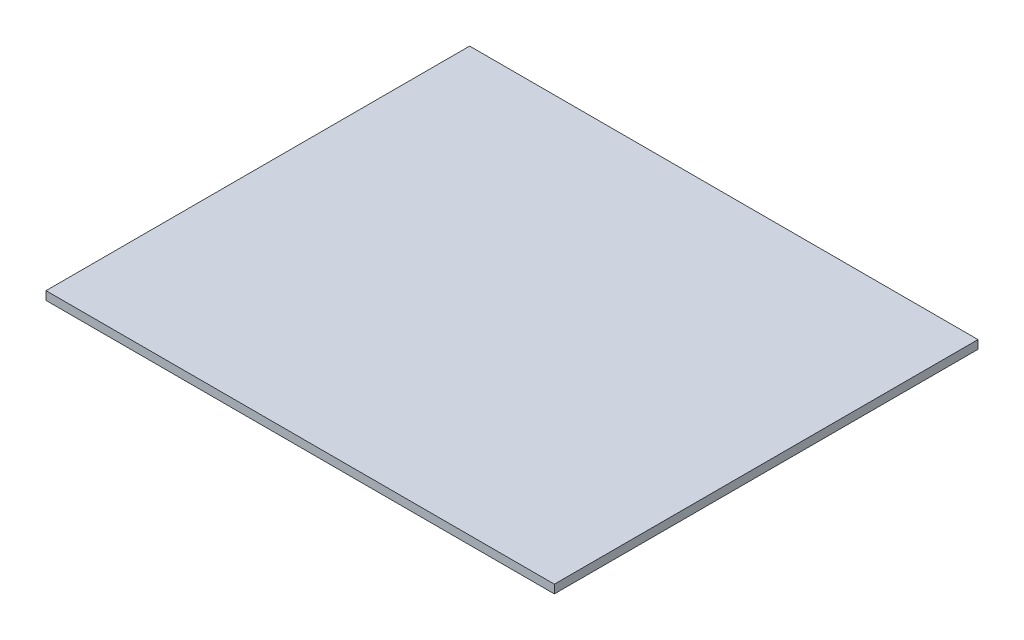
ISO-10303-21;
HEADER;
FILE_DESCRIPTION(('STEP AP214'),'2;1');
FILE_NAME('part.step','',(''),(''),'','','');
FILE_SCHEMA(('AUTOMOTIVE_DESIGN { 1 0 10303 214 1 1 1 1 }'));
ENDSEC;
DATA;
#1=APPLICATION_CONTEXT('core data for automotive mechanical design processes');
#2=APPLICATION_PROTOCOL_DEFINITION('international standard','automotive_design',2000,#1);
#3=PRODUCT_CONTEXT('',#1,'mechanical');
#4=PRODUCT('Part','Part','',(#3));
#5=PRODUCT_RELATED_PRODUCT_CATEGORY('part','',(#4));
#6=PRODUCT_DEFINITION_FORMATION('','',#4);
#7=PRODUCT_DEFINITION_CONTEXT('part definition',#1,'design');
#8=PRODUCT_DEFINITION('design','',#6,#7);
#9=PRODUCT_DEFINITION_SHAPE('','',#8);
#10=(LENGTH_UNIT() NAMED_UNIT(*) SI_UNIT(.MILLI.,.METRE.));
#11=(NAMED_UNIT(*) PLANE_ANGLE_UNIT() SI_UNIT($,.RADIAN.));
#12=(NAMED_UNIT(*) SI_UNIT($,.STERADIAN.) SOLID_ANGLE_UNIT());
#13=UNCERTAINTY_MEASURE_WITH_UNIT(LENGTH_MEASURE(1.E-05),#10,'distance_accuracy_value','');
#14=(GEOMETRIC_REPRESENTATION_CONTEXT(3) GLOBAL_UNCERTAINTY_ASSIGNED_CONTEXT((#13)) GLOBAL_UNIT_ASSIGNED_CONTEXT((#10,
#11,#12)) REPRESENTATION_CONTEXT('',''));
#15=CARTESIAN_POINT('',(0.,0.,0.));
#16=DIRECTION('',(0.,0.,1.));
#17=DIRECTION('',(1.,0.,0.));
#18=AXIS2_PLACEMENT_3D('',#15,#16,#17);
#19=CARTESIAN_POINT('',(90.,3.,75.));
#20=DIRECTION('',(-1.,0.,0.));
#21=DIRECTION('',(0.,0.,1.));
#22=AXIS2_PLACEMENT_3D('',#19,#20,#21);
#23=PLANE('',#22);
#24=DIRECTION('',(0.,0.,-1.));
#25=VECTOR('',#24,1.);
#26=CARTESIAN_POINT('',(90.,0.,75.));
#27=LINE('',#26,#25);
#28=CARTESIAN_POINT('',(90.,0.,75.));
#29=VERTEX_POINT('',#28);
#30=CARTESIAN_POINT('',(90.,0.,-75.));
#31=VERTEX_POINT('',#30);
#32=EDGE_CURVE('E98',#29,#31,#27,.T.);
#33=ORIENTED_EDGE('',*,*,#32,.T.);
#34=DIRECTION('',(0.,-1.,0.));
#35=VECTOR('',#34,1.);
#36=CARTESIAN_POINT('',(90.,3.,-75.));
#37=LINE('',#36,#35);
#38=CARTESIAN_POINT('',(90.,3.,-75.));
#39=VERTEX_POINT('',#38);
#40=EDGE_CURVE('E11',#39,#31,#37,.T.);
#41=ORIENTED_EDGE('',*,*,#40,.F.);
#42=DIRECTION('',(0.,0.,-1.));
#43=VECTOR('',#42,1.);
#44=CARTESIAN_POINT('',(90.,3.,75.));
#45=LINE('',#44,#43);
#46=CARTESIAN_POINT('',(90.,3.,75.));
#47=VERTEX_POINT('',#46);
#48=EDGE_CURVE('E86',#47,#39,#45,.T.);
#49=ORIENTED_EDGE('',*,*,#48,.F.);
#50=DIRECTION('',(0.,-1.,0.));
#51=VECTOR('',#50,1.);
#52=CARTESIAN_POINT('',(90.,3.,75.));
#53=LINE('',#52,#51);
#54=EDGE_CURVE('E94',#47,#29,#53,.T.);
#55=ORIENTED_EDGE('',*,*,#54,.T.);
#56=EDGE_LOOP('',(#33,#41,#49,#55));
#57=FACE_BOUND('',#56,.T.);
#58=ADVANCED_FACE('F35',(#57),#23,.F.);
#59=CARTESIAN_POINT('',(-90.,3.,-75.));
#60=DIRECTION('',(0.,0.,1.));
#61=DIRECTION('',(1.,0.,0.));
#62=AXIS2_PLACEMENT_3D('',#59,#60,#61);
#63=PLANE('',#62);
#64=DIRECTION('',(-1.,0.,0.));
#65=VECTOR('',#64,1.);
#66=CARTESIAN_POINT('',(-90.,0.,-75.));
#67=LINE('',#66,#65);
#68=CARTESIAN_POINT('',(-90.,0.,-75.));
#69=VERTEX_POINT('',#68);
#70=EDGE_CURVE('E90',#31,#69,#67,.T.);
#71=ORIENTED_EDGE('',*,*,#70,.T.);
#72=DIRECTION('',(0.,-1.,0.));
#73=VECTOR('',#72,1.);
#74=CARTESIAN_POINT('',(-90.,3.,-75.));
#75=LINE('',#74,#73);
#76=CARTESIAN_POINT('',(-90.,3.,-75.));
#77=VERTEX_POINT('',#76);
#78=EDGE_CURVE('E43',#77,#69,#75,.T.);
#79=ORIENTED_EDGE('',*,*,#78,.F.);
#80=DIRECTION('',(-1.,0.,0.));
#81=VECTOR('',#80,1.);
#82=CARTESIAN_POINT('',(-90.,3.,-75.));
#83=LINE('',#82,#81);
#84=EDGE_CURVE('E81',#39,#77,#83,.T.);
#85=ORIENTED_EDGE('',*,*,#84,.F.);
#86=ORIENTED_EDGE('',*,*,#40,.T.);
#87=EDGE_LOOP('',(#71,#79,#85,#86));
#88=FACE_BOUND('',#87,.T.);
#89=ADVANCED_FACE('F89',(#88),#63,.F.);
#90=CARTESIAN_POINT('',(-90.,3.,75.));
#91=DIRECTION('',(1.,0.,0.));
#92=DIRECTION('',(0.,0.,-1.));
#93=AXIS2_PLACEMENT_3D('',#90,#91,#92);
#94=PLANE('',#93);
#95=DIRECTION('',(0.,0.,1.));
#96=VECTOR('',#95,1.);
#97=CARTESIAN_POINT('',(-90.,0.,75.));
#98=LINE('',#97,#96);
#99=CARTESIAN_POINT('',(-90.,0.,75.));
#100=VERTEX_POINT('',#99);
#101=EDGE_CURVE('E68',#69,#100,#98,.T.);
#102=ORIENTED_EDGE('',*,*,#101,.T.);
#103=DIRECTION('',(0.,-1.,0.));
#104=VECTOR('',#103,1.);
#105=CARTESIAN_POINT('',(-90.,3.,75.));
#106=LINE('',#105,#104);
#107=CARTESIAN_POINT('',(-90.,3.,75.));
#108=VERTEX_POINT('',#107);
#109=EDGE_CURVE('E91',#108,#100,#106,.T.);
#110=ORIENTED_EDGE('',*,*,#109,.F.);
#111=DIRECTION('',(0.,0.,1.));
#112=VECTOR('',#111,1.);
#113=CARTESIAN_POINT('',(-90.,3.,75.));
#114=LINE('',#113,#112);
#115=EDGE_CURVE('E84',#77,#108,#114,.T.);
#116=ORIENTED_EDGE('',*,*,#115,.F.);
#117=ORIENTED_EDGE('',*,*,#78,.T.);
#118=EDGE_LOOP('',(#102,#110,#116,#117));
#119=FACE_BOUND('',#118,.T.);
#120=ADVANCED_FACE('F92',(#119),#94,.F.);
#121=CARTESIAN_POINT('',(-90.,3.,75.));
#122=DIRECTION('',(0.,0.,-1.));
#123=DIRECTION('',(-1.,0.,0.));
#124=AXIS2_PLACEMENT_3D('',#121,#122,#123);
#125=PLANE('',#124);
#126=DIRECTION('',(1.,0.,0.));
#127=VECTOR('',#126,1.);
#128=CARTESIAN_POINT('',(-90.,0.,75.));
#129=LINE('',#128,#127);
#130=EDGE_CURVE('E74',#100,#29,#129,.T.);
#131=ORIENTED_EDGE('',*,*,#130,.T.);
#132=ORIENTED_EDGE('',*,*,#54,.F.);
#133=DIRECTION('',(1.,0.,0.));
#134=VECTOR('',#133,1.);
#135=CARTESIAN_POINT('',(-90.,3.,75.));
#136=LINE('',#135,#134);
#137=EDGE_CURVE('E51',#108,#47,#136,.T.);
#138=ORIENTED_EDGE('',*,*,#137,.F.);
#139=ORIENTED_EDGE('',*,*,#109,.T.);
#140=EDGE_LOOP('',(#131,#132,#138,#139));
#141=FACE_BOUND('',#140,.T.);
#142=ADVANCED_FACE('F105',(#141),#125,.F.);
#143=CARTESIAN_POINT('',(0.,3.,0.));
#144=DIRECTION('',(0.,-1.,0.));
#145=DIRECTION('',(0.,0.,-1.));
#146=AXIS2_PLACEMENT_3D('',#143,#144,#145);
#147=PLANE('',#146);
#148=ORIENTED_EDGE('',*,*,#48,.T.);
#149=ORIENTED_EDGE('',*,*,#84,.T.);
#150=ORIENTED_EDGE('',*,*,#115,.T.);
#151=ORIENTED_EDGE('',*,*,#137,.T.);
#152=EDGE_LOOP('',(#148,#149,#150,#151));
#153=FACE_BOUND('',#152,.T.);
#154=ADVANCED_FACE('F82',(#153),#147,.F.);
#155=CARTESIAN_POINT('',(0.,0.,0.));
#156=DIRECTION('',(0.,-1.,0.));
#157=DIRECTION('',(0.,0.,-1.));
#158=AXIS2_PLACEMENT_3D('',#155,#156,#157);
#159=PLANE('',#158);
#160=ORIENTED_EDGE('',*,*,#32,.F.);
#161=ORIENTED_EDGE('',*,*,#130,.F.);
#162=ORIENTED_EDGE('',*,*,#101,.F.);
#163=ORIENTED_EDGE('',*,*,#70,.F.);
#164=EDGE_LOOP('',(#160,#161,#162,#163));
#165=FACE_BOUND('',#164,.T.);
#166=ADVANCED_FACE('F108',(#165),#159,.T.);
#167=CLOSED_SHELL('',(#58,#89,#120,#142,#154,#166));
#168=MANIFOLD_SOLID_BREP('B2',#167);
#169=ADVANCED_BREP_SHAPE_REPRESENTATION('',(#18,#168),#14);
#170=SHAPE_DEFINITION_REPRESENTATION(#9,#169);
ENDSEC;
END-ISO-10303-21;
